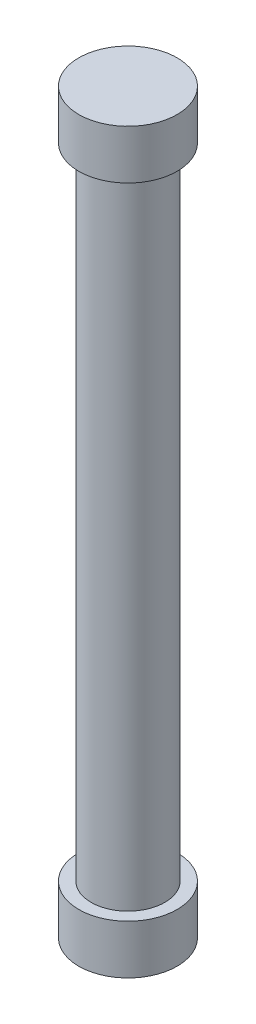
ISO-10303-21;
HEADER;
FILE_DESCRIPTION(('STEP AP214'),'2;1');
FILE_NAME('part.step','',(''),(''),'','','');
FILE_SCHEMA(('AUTOMOTIVE_DESIGN { 1 0 10303 214 1 1 1 1 }'));
ENDSEC;
DATA;
#1=APPLICATION_CONTEXT('core data for automotive mechanical design processes');
#2=APPLICATION_PROTOCOL_DEFINITION('international standard','automotive_design',2000,#1);
#3=PRODUCT_CONTEXT('',#1,'mechanical');
#4=PRODUCT('Part','Part','',(#3));
#5=PRODUCT_RELATED_PRODUCT_CATEGORY('part','',(#4));
#6=PRODUCT_DEFINITION_FORMATION('','',#4);
#7=PRODUCT_DEFINITION_CONTEXT('part definition',#1,'design');
#8=PRODUCT_DEFINITION('design','',#6,#7);
#9=PRODUCT_DEFINITION_SHAPE('','',#8);
#10=(LENGTH_UNIT() NAMED_UNIT(*) SI_UNIT(.MILLI.,.METRE.));
#11=(NAMED_UNIT(*) PLANE_ANGLE_UNIT() SI_UNIT($,.RADIAN.));
#12=(NAMED_UNIT(*) SI_UNIT($,.STERADIAN.) SOLID_ANGLE_UNIT());
#13=UNCERTAINTY_MEASURE_WITH_UNIT(LENGTH_MEASURE(1.E-05),#10,'distance_accuracy_value','');
#14=(GEOMETRIC_REPRESENTATION_CONTEXT(3) GLOBAL_UNCERTAINTY_ASSIGNED_CONTEXT((#13)) GLOBAL_UNIT_ASSIGNED_CONTEXT((#10,
#11,#12)) REPRESENTATION_CONTEXT('',''));
#15=CARTESIAN_POINT('',(0.,0.,0.));
#16=DIRECTION('',(0.,0.,1.));
#17=DIRECTION('',(1.,0.,0.));
#18=AXIS2_PLACEMENT_3D('',#15,#16,#17);
#19=CARTESIAN_POINT('',(0.,-2.66847826086956,-0.98913043478261));
#20=DIRECTION('',(0.,-1.,0.));
#21=DIRECTION('',(0.,0.,-1.));
#22=AXIS2_PLACEMENT_3D('',#19,#20,#21);
#23=PLANE('',#22);
#24=CARTESIAN_POINT('',(0.,-2.66847826086956,-0.98913043478261));
#25=DIRECTION('',(0.,1.,0.));
#26=DIRECTION('',(0.,0.,1.));
#27=AXIS2_PLACEMENT_3D('',#24,#25,#26);
#28=CIRCLE('',#27,2.);
#29=CARTESIAN_POINT('',(0.,-2.66847826086956,1.01086956521739));
#30=VERTEX_POINT('',#29);
#31=EDGE_CURVE('E10',#30,#30,#28,.T.);
#32=ORIENTED_EDGE('',*,*,#31,.F.);
#33=EDGE_LOOP('',(#32));
#34=FACE_BOUND('',#33,.T.);
#35=ADVANCED_FACE('F39',(#34),#23,.T.);
#36=CARTESIAN_POINT('',(0.,27.3315217391304,-0.989130434782604));
#37=DIRECTION('',(0.,1.,0.));
#38=DIRECTION('',(0.,0.,1.));
#39=AXIS2_PLACEMENT_3D('',#36,#37,#38);
#40=CYLINDRICAL_SURFACE('',#39,2.);
#41=ORIENTED_EDGE('',*,*,#31,.T.);
#42=EDGE_LOOP('',(#41));
#43=FACE_BOUND('',#42,.T.);
#44=CARTESIAN_POINT('',(0.,-0.668478260869562,-0.989130434782609));
#45=DIRECTION('',(0.,1.,0.));
#46=DIRECTION('',(0.,0.,1.));
#47=AXIS2_PLACEMENT_3D('',#44,#45,#46);
#48=CIRCLE('',#47,2.);
#49=CARTESIAN_POINT('',(0.,-0.668478260869563,1.01086956521739));
#50=VERTEX_POINT('',#49);
#51=EDGE_CURVE('E46',#50,#50,#48,.T.);
#52=ORIENTED_EDGE('',*,*,#51,.F.);
#53=EDGE_LOOP('',(#52));
#54=FACE_BOUND('',#53,.T.);
#55=ADVANCED_FACE('F87',(#43,#54),#40,.T.);
#56=CARTESIAN_POINT('',(0.,-0.668478260869563,1.01086956521739));
#57=DIRECTION('',(0.,1.,0.));
#58=DIRECTION('',(0.,0.,1.));
#59=AXIS2_PLACEMENT_3D('',#56,#57,#58);
#60=PLANE('',#59);
#61=ORIENTED_EDGE('',*,*,#51,.T.);
#62=EDGE_LOOP('',(#61));
#63=FACE_BOUND('',#62,.T.);
#64=CARTESIAN_POINT('',(0.,-0.668478260869562,-0.989130434782609));
#65=DIRECTION('',(0.,1.,0.));
#66=DIRECTION('',(0.,0.,1.));
#67=AXIS2_PLACEMENT_3D('',#64,#65,#66);
#68=CIRCLE('',#67,1.5);
#69=CARTESIAN_POINT('',(0.,-0.668478260869563,0.51086956521739));
#70=VERTEX_POINT('',#69);
#71=EDGE_CURVE('E51',#70,#70,#68,.T.);
#72=ORIENTED_EDGE('',*,*,#71,.F.);
#73=EDGE_LOOP('',(#72));
#74=FACE_BOUND('',#73,.T.);
#75=ADVANCED_FACE('F92',(#63,#74),#60,.T.);
#76=CARTESIAN_POINT('',(0.,27.3315217391304,-0.989130434782604));
#77=DIRECTION('',(0.,1.,0.));
#78=DIRECTION('',(0.,0.,1.));
#79=AXIS2_PLACEMENT_3D('',#76,#77,#78);
#80=CYLINDRICAL_SURFACE('',#79,1.5);
#81=ORIENTED_EDGE('',*,*,#71,.T.);
#82=EDGE_LOOP('',(#81));
#83=FACE_BOUND('',#82,.T.);
#84=CARTESIAN_POINT('',(0.,25.3315217391304,-0.989130434782604));
#85=DIRECTION('',(0.,1.,0.));
#86=DIRECTION('',(0.,0.,1.));
#87=AXIS2_PLACEMENT_3D('',#84,#85,#86);
#88=CIRCLE('',#87,1.5);
#89=CARTESIAN_POINT('',(0.,25.3315217391304,0.510869565217393));
#90=VERTEX_POINT('',#89);
#91=EDGE_CURVE('E56',#90,#90,#88,.T.);
#92=ORIENTED_EDGE('',*,*,#91,.F.);
#93=EDGE_LOOP('',(#92));
#94=FACE_BOUND('',#93,.T.);
#95=ADVANCED_FACE('F83',(#83,#94),#80,.T.);
#96=CARTESIAN_POINT('',(0.,25.3315217391304,0.510869565217393));
#97=DIRECTION('',(0.,-1.,0.));
#98=DIRECTION('',(0.,0.,-1.));
#99=AXIS2_PLACEMENT_3D('',#96,#97,#98);
#100=PLANE('',#99);
#101=ORIENTED_EDGE('',*,*,#91,.T.);
#102=EDGE_LOOP('',(#101));
#103=FACE_BOUND('',#102,.T.);
#104=CARTESIAN_POINT('',(0.,25.3315217391304,-0.989130434782604));
#105=DIRECTION('',(0.,1.,0.));
#106=DIRECTION('',(0.,0.,1.));
#107=AXIS2_PLACEMENT_3D('',#104,#105,#106);
#108=CIRCLE('',#107,2.);
#109=CARTESIAN_POINT('',(0.,25.3315217391304,1.0108695652174));
#110=VERTEX_POINT('',#109);
#111=EDGE_CURVE('E62',#110,#110,#108,.T.);
#112=ORIENTED_EDGE('',*,*,#111,.F.);
#113=EDGE_LOOP('',(#112));
#114=FACE_BOUND('',#113,.T.);
#115=ADVANCED_FACE('F75',(#103,#114),#100,.T.);
#116=CARTESIAN_POINT('',(0.,27.3315217391304,-0.989130434782604));
#117=DIRECTION('',(0.,1.,0.));
#118=DIRECTION('',(0.,0.,1.));
#119=AXIS2_PLACEMENT_3D('',#116,#117,#118);
#120=CYLINDRICAL_SURFACE('',#119,2.);
#121=ORIENTED_EDGE('',*,*,#111,.T.);
#122=EDGE_LOOP('',(#121));
#123=FACE_BOUND('',#122,.T.);
#124=CARTESIAN_POINT('',(0.,27.3315217391304,-0.989130434782604));
#125=DIRECTION('',(0.,1.,0.));
#126=DIRECTION('',(0.,0.,1.));
#127=AXIS2_PLACEMENT_3D('',#124,#125,#126);
#128=CIRCLE('',#127,2.);
#129=CARTESIAN_POINT('',(0.,27.3315217391304,1.0108695652174));
#130=VERTEX_POINT('',#129);
#131=EDGE_CURVE('E66',#130,#130,#128,.T.);
#132=ORIENTED_EDGE('',*,*,#131,.F.);
#133=EDGE_LOOP('',(#132));
#134=FACE_BOUND('',#133,.T.);
#135=ADVANCED_FACE('F73',(#123,#134),#120,.T.);
#136=CARTESIAN_POINT('',(0.,27.3315217391304,1.0108695652174));
#137=DIRECTION('',(0.,1.,0.));
#138=DIRECTION('',(0.,0.,1.));
#139=AXIS2_PLACEMENT_3D('',#136,#137,#138);
#140=PLANE('',#139);
#141=ORIENTED_EDGE('',*,*,#131,.T.);
#142=EDGE_LOOP('',(#141));
#143=FACE_BOUND('',#142,.T.);
#144=ADVANCED_FACE('F71',(#143),#140,.T.);
#145=CLOSED_SHELL('',(#35,#55,#75,#95,#115,#135,#144));
#146=MANIFOLD_SOLID_BREP('B2',#145);
#147=ADVANCED_BREP_SHAPE_REPRESENTATION('',(#18,#146),#14);
#148=SHAPE_DEFINITION_REPRESENTATION(#9,#147);
ENDSEC;
END-ISO-10303-21;
